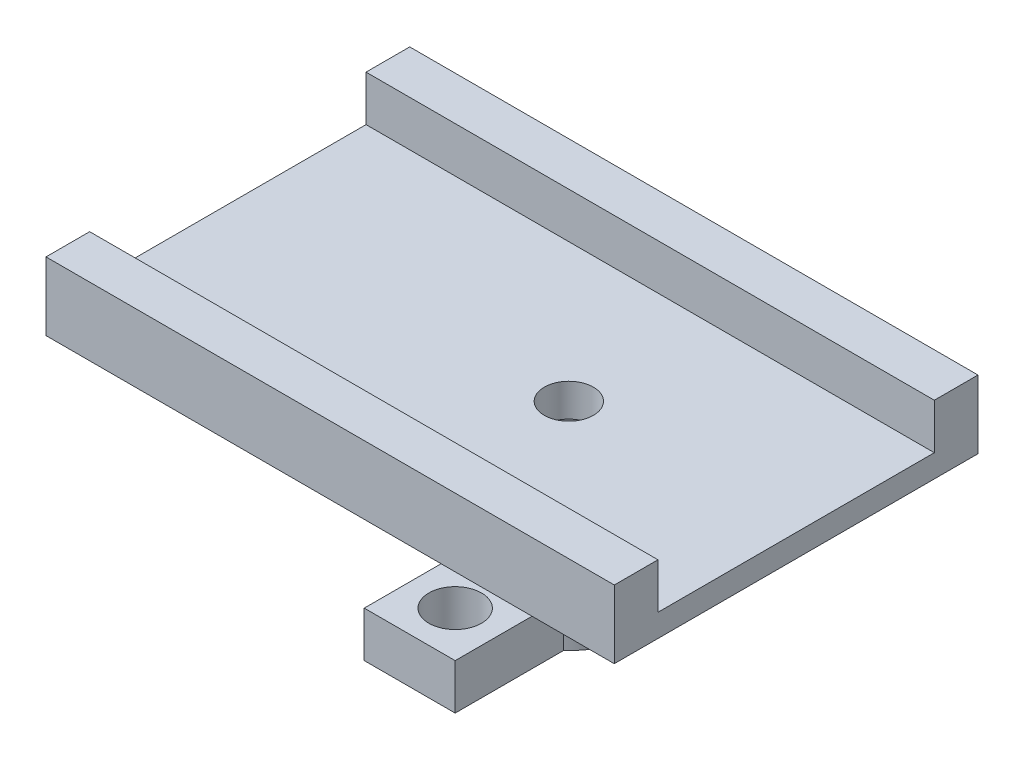
ISO-10303-21;
HEADER;
FILE_DESCRIPTION(('STEP AP214'),'2;1');
FILE_NAME('part.step','',(''),(''),'','','');
FILE_SCHEMA(('AUTOMOTIVE_DESIGN { 1 0 10303 214 1 1 1 1 }'));
ENDSEC;
DATA;
#1=APPLICATION_CONTEXT('core data for automotive mechanical design processes');
#2=APPLICATION_PROTOCOL_DEFINITION('international standard','automotive_design',2000,#1);
#3=PRODUCT_CONTEXT('',#1,'mechanical');
#4=PRODUCT('Part','Part','',(#3));
#5=PRODUCT_RELATED_PRODUCT_CATEGORY('part','',(#4));
#6=PRODUCT_DEFINITION_FORMATION('','',#4);
#7=PRODUCT_DEFINITION_CONTEXT('part definition',#1,'design');
#8=PRODUCT_DEFINITION('design','',#6,#7);
#9=PRODUCT_DEFINITION_SHAPE('','',#8);
#10=(LENGTH_UNIT() NAMED_UNIT(*) SI_UNIT(.MILLI.,.METRE.));
#11=(NAMED_UNIT(*) PLANE_ANGLE_UNIT() SI_UNIT($,.RADIAN.));
#12=(NAMED_UNIT(*) SI_UNIT($,.STERADIAN.) SOLID_ANGLE_UNIT());
#13=UNCERTAINTY_MEASURE_WITH_UNIT(LENGTH_MEASURE(1.E-05),#10,'distance_accuracy_value','');
#14=(GEOMETRIC_REPRESENTATION_CONTEXT(3) GLOBAL_UNCERTAINTY_ASSIGNED_CONTEXT((#13)) GLOBAL_UNIT_ASSIGNED_CONTEXT((#10,
#11,#12)) REPRESENTATION_CONTEXT('',''));
#15=CARTESIAN_POINT('',(0.,0.,0.));
#16=DIRECTION('',(0.,0.,1.));
#17=DIRECTION('',(1.,0.,0.));
#18=AXIS2_PLACEMENT_3D('',#15,#16,#17);
#19=CARTESIAN_POINT('',(47.625,-37.6757684192075,0.));
#20=DIRECTION('',(0.,1.,0.));
#21=DIRECTION('',(0.,0.,1.));
#22=AXIS2_PLACEMENT_3D('',#19,#20,#21);
#23=CYLINDRICAL_SURFACE('',#22,9.525);
#24=DIRECTION('',(0.,-1.,0.));
#25=VECTOR('',#24,1.);
#26=CARTESIAN_POINT('',(53.975,-4.38500005600004,-7.09951582856183));
#27=LINE('',#26,#25);
#28=CARTESIAN_POINT('',(53.975,-4.38500005600004,-7.09951582856183));
#29=VERTEX_POINT('',#28);
#30=CARTESIAN_POINT('',(53.975,-10.735000056,-7.09951582856183));
#31=VERTEX_POINT('',#30);
#32=EDGE_CURVE('E63',#29,#31,#27,.T.);
#33=ORIENTED_EDGE('',*,*,#32,.F.);
#34=CARTESIAN_POINT('',(47.625,-4.38500005600004,0.));
#35=DIRECTION('',(0.,1.,0.));
#36=DIRECTION('',(0.,0.,-1.));
#37=AXIS2_PLACEMENT_3D('',#34,#35,#36);
#38=CIRCLE('',#37,9.525);
#39=CARTESIAN_POINT('',(41.275,-4.38500005600004,-7.09951582856183));
#40=VERTEX_POINT('',#39);
#41=EDGE_CURVE('E58',#29,#40,#38,.T.);
#42=ORIENTED_EDGE('',*,*,#41,.T.);
#43=DIRECTION('',(0.,-1.,0.));
#44=VECTOR('',#43,1.);
#45=CARTESIAN_POINT('',(41.275,-4.38500005600004,-7.09951582856183));
#46=LINE('',#45,#44);
#47=CARTESIAN_POINT('',(41.275,-10.735000056,-7.09951582856183));
#48=VERTEX_POINT('',#47);
#49=EDGE_CURVE('E201',#40,#48,#46,.T.);
#50=ORIENTED_EDGE('',*,*,#49,.T.);
#51=CARTESIAN_POINT('',(47.625,-10.735000056,0.));
#52=DIRECTION('',(0.,-1.,0.));
#53=DIRECTION('',(0.,0.,-1.));
#54=AXIS2_PLACEMENT_3D('',#51,#52,#53);
#55=CIRCLE('',#54,9.525);
#56=CARTESIAN_POINT('',(41.275,-10.735000056,7.09951582856183));
#57=VERTEX_POINT('',#56);
#58=EDGE_CURVE('E283',#48,#57,#55,.F.);
#59=ORIENTED_EDGE('',*,*,#58,.T.);
#60=DIRECTION('',(0.,-1.,0.));
#61=VECTOR('',#60,1.);
#62=CARTESIAN_POINT('',(41.275,-4.38500005600004,7.09951582856183));
#63=LINE('',#62,#61);
#64=CARTESIAN_POINT('',(41.275,-4.38500005600004,7.09951582856183));
#65=VERTEX_POINT('',#64);
#66=EDGE_CURVE('E252',#65,#57,#63,.T.);
#67=ORIENTED_EDGE('',*,*,#66,.F.);
#68=CARTESIAN_POINT('',(47.625,-4.38500005600004,0.));
#69=DIRECTION('',(0.,1.,0.));
#70=DIRECTION('',(0.,0.,-1.));
#71=AXIS2_PLACEMENT_3D('',#68,#69,#70);
#72=CIRCLE('',#71,9.525);
#73=CARTESIAN_POINT('',(53.975,-4.38500005600004,7.09951582856183));
#74=VERTEX_POINT('',#73);
#75=EDGE_CURVE('E233',#65,#74,#72,.T.);
#76=ORIENTED_EDGE('',*,*,#75,.T.);
#77=DIRECTION('',(0.,-1.,0.));
#78=VECTOR('',#77,1.);
#79=CARTESIAN_POINT('',(53.975,-4.38500005600004,7.09951582856183));
#80=LINE('',#79,#78);
#81=CARTESIAN_POINT('',(53.975,-10.735000056,7.09951582856183));
#82=VERTEX_POINT('',#81);
#83=EDGE_CURVE('E249',#74,#82,#80,.T.);
#84=ORIENTED_EDGE('',*,*,#83,.T.);
#85=EDGE_CURVE('E281',#82,#31,#55,.F.);
#86=ORIENTED_EDGE('',*,*,#85,.T.);
#87=EDGE_LOOP('',(#33,#42,#50,#59,#67,#76,#84,#86));
#88=FACE_BOUND('',#87,.T.);
#89=DIRECTION('',(0.,-1.,0.));
#90=VECTOR('',#89,1.);
#91=CARTESIAN_POINT('',(53.43125,28.5761062672984,-7.55070102291833));
#92=LINE('',#91,#90);
#93=CARTESIAN_POINT('',(53.43125,3.175,-7.55070102291833));
#94=VERTEX_POINT('',#93);
#95=CARTESIAN_POINT('',(53.43125,0.785874999999992,-7.55070102291833));
#96=VERTEX_POINT('',#95);
#97=EDGE_CURVE('E248',#94,#96,#92,.T.);
#98=ORIENTED_EDGE('',*,*,#97,.F.);
#99=CARTESIAN_POINT('',(47.625,3.175,0.));
#100=DIRECTION('',(0.,1.,0.));
#101=DIRECTION('',(0.,0.,1.));
#102=AXIS2_PLACEMENT_3D('',#99,#100,#101);
#103=CIRCLE('',#102,9.525);
#104=CARTESIAN_POINT('',(41.81875,3.175,-7.55070102291833));
#105=VERTEX_POINT('',#104);
#106=EDGE_CURVE('E374',#94,#105,#103,.F.);
#107=ORIENTED_EDGE('',*,*,#106,.T.);
#108=DIRECTION('',(0.,-1.,0.));
#109=VECTOR('',#108,1.);
#110=CARTESIAN_POINT('',(41.81875,28.5761062672984,-7.55070102291833));
#111=LINE('',#110,#109);
#112=CARTESIAN_POINT('',(41.81875,0.785874999999992,-7.55070102291833));
#113=VERTEX_POINT('',#112);
#114=EDGE_CURVE('E259',#105,#113,#111,.T.);
#115=ORIENTED_EDGE('',*,*,#114,.T.);
#116=CARTESIAN_POINT('',(47.625,0.785874999999992,0.));
#117=DIRECTION('',(0.,1.,0.));
#118=DIRECTION('',(0.,0.,1.));
#119=AXIS2_PLACEMENT_3D('',#116,#117,#118);
#120=CIRCLE('',#119,9.525);
#121=EDGE_CURVE('E256',#96,#113,#120,.T.);
#122=ORIENTED_EDGE('',*,*,#121,.F.);
#123=EDGE_LOOP('',(#98,#107,#115,#122));
#124=FACE_BOUND('',#123,.T.);
#125=ADVANCED_FACE('F37',(#88,#124),#23,.T.);
#126=CARTESIAN_POINT('',(-54.6910193932159,9.525,25.4));
#127=DIRECTION('',(0.,1.,0.));
#128=DIRECTION('',(0.,0.,1.));
#129=AXIS2_PLACEMENT_3D('',#126,#127,#128);
#130=PLANE('',#129);
#131=CARTESIAN_POINT('',(47.625,9.525,0.));
#132=DIRECTION('',(0.,1.,0.));
#133=DIRECTION('',(0.,0.,1.));
#134=AXIS2_PLACEMENT_3D('',#131,#132,#133);
#135=CIRCLE('',#134,15.875);
#136=CARTESIAN_POINT('',(47.625,9.525,15.875));
#137=VERTEX_POINT('',#136);
#138=EDGE_CURVE('E336',#137,#137,#135,.T.);
#139=ORIENTED_EDGE('',*,*,#138,.T.);
#140=EDGE_LOOP('',(#139));
#141=FACE_BOUND('',#140,.T.);
#142=DIRECTION('',(0.,0.,-1.));
#143=VECTOR('',#142,1.);
#144=CARTESIAN_POINT('',(0.,9.525,25.4));
#145=LINE('',#144,#143);
#146=CARTESIAN_POINT('',(0.,9.52500000000003,25.4));
#147=VERTEX_POINT('',#146);
#148=CARTESIAN_POINT('',(0.,9.52500000000003,-25.4));
#149=VERTEX_POINT('',#148);
#150=EDGE_CURVE('E354',#147,#149,#145,.T.);
#151=ORIENTED_EDGE('',*,*,#150,.T.);
#152=DIRECTION('',(1.,0.,0.));
#153=VECTOR('',#152,1.);
#154=CARTESIAN_POINT('',(-54.6910193932159,9.525,-25.4));
#155=LINE('',#154,#153);
#156=CARTESIAN_POINT('',(79.375,9.52500000000003,-25.4));
#157=VERTEX_POINT('',#156);
#158=EDGE_CURVE('E357',#149,#157,#155,.T.);
#159=ORIENTED_EDGE('',*,*,#158,.T.);
#160=DIRECTION('',(0.,0.,1.));
#161=VECTOR('',#160,1.);
#162=CARTESIAN_POINT('',(79.375,9.525,25.4));
#163=LINE('',#162,#161);
#164=CARTESIAN_POINT('',(79.375,9.52500000000003,25.4));
#165=VERTEX_POINT('',#164);
#166=EDGE_CURVE('E303',#157,#165,#163,.T.);
#167=ORIENTED_EDGE('',*,*,#166,.T.);
#168=DIRECTION('',(1.,0.,0.));
#169=VECTOR('',#168,1.);
#170=CARTESIAN_POINT('',(-54.6910193932159,9.525,25.4));
#171=LINE('',#170,#169);
#172=EDGE_CURVE('E308',#147,#165,#171,.T.);
#173=ORIENTED_EDGE('',*,*,#172,.F.);
#174=EDGE_LOOP('',(#151,#159,#167,#173));
#175=FACE_BOUND('',#174,.T.);
#176=ADVANCED_FACE('F412',(#141,#175),#130,.F.);
#177=CARTESIAN_POINT('',(0.,106.939220205815,25.4));
#178=DIRECTION('',(1.,0.,0.));
#179=DIRECTION('',(0.,0.,-1.));
#180=AXIS2_PLACEMENT_3D('',#177,#178,#179);
#181=PLANE('',#180);
#182=ORIENTED_EDGE('',*,*,#150,.F.);
#183=DIRECTION('',(0.,-1.,0.));
#184=VECTOR('',#183,1.);
#185=CARTESIAN_POINT('',(0.,106.939220205815,25.4));
#186=LINE('',#185,#184);
#187=CARTESIAN_POINT('',(0.,19.05,25.4));
#188=VERTEX_POINT('',#187);
#189=EDGE_CURVE('E367',#188,#147,#186,.T.);
#190=ORIENTED_EDGE('',*,*,#189,.F.);
#191=DIRECTION('',(0.,0.,1.));
#192=VECTOR('',#191,1.);
#193=CARTESIAN_POINT('',(0.,19.05,19.3));
#194=LINE('',#193,#192);
#195=CARTESIAN_POINT('',(0.,19.05,19.3));
#196=VERTEX_POINT('',#195);
#197=EDGE_CURVE('E343',#196,#188,#194,.T.);
#198=ORIENTED_EDGE('',*,*,#197,.F.);
#199=DIRECTION('',(0.,-1.,0.));
#200=VECTOR('',#199,1.);
#201=CARTESIAN_POINT('',(0.,98.659048637702,19.3));
#202=LINE('',#201,#200);
#203=CARTESIAN_POINT('',(0.,12.7,19.3));
#204=VERTEX_POINT('',#203);
#205=EDGE_CURVE('E334',#196,#204,#202,.T.);
#206=ORIENTED_EDGE('',*,*,#205,.T.);
#207=DIRECTION('',(0.,0.,-1.));
#208=VECTOR('',#207,1.);
#209=CARTESIAN_POINT('',(0.,12.7,25.4));
#210=LINE('',#209,#208);
#211=CARTESIAN_POINT('',(0.,12.7,-19.3));
#212=VERTEX_POINT('',#211);
#213=EDGE_CURVE('E307',#204,#212,#210,.T.);
#214=ORIENTED_EDGE('',*,*,#213,.T.);
#215=DIRECTION('',(0.,-1.,0.));
#216=VECTOR('',#215,1.);
#217=CARTESIAN_POINT('',(0.,98.659048637702,-19.3));
#218=LINE('',#217,#216);
#219=CARTESIAN_POINT('',(0.,19.05,-19.3));
#220=VERTEX_POINT('',#219);
#221=EDGE_CURVE('E315',#220,#212,#218,.T.);
#222=ORIENTED_EDGE('',*,*,#221,.F.);
#223=DIRECTION('',(0.,0.,1.));
#224=VECTOR('',#223,1.);
#225=CARTESIAN_POINT('',(0.,19.05,-19.3));
#226=LINE('',#225,#224);
#227=CARTESIAN_POINT('',(0.,19.05,-25.4));
#228=VERTEX_POINT('',#227);
#229=EDGE_CURVE('E328',#228,#220,#226,.T.);
#230=ORIENTED_EDGE('',*,*,#229,.F.);
#231=DIRECTION('',(0.,-1.,0.));
#232=VECTOR('',#231,1.);
#233=CARTESIAN_POINT('',(0.,106.939220205815,-25.4));
#234=LINE('',#233,#232);
#235=EDGE_CURVE('E364',#228,#149,#234,.T.);
#236=ORIENTED_EDGE('',*,*,#235,.T.);
#237=EDGE_LOOP('',(#182,#190,#198,#206,#214,#222,#230,#236));
#238=FACE_BOUND('',#237,.T.);
#239=ADVANCED_FACE('F421',(#238),#181,.F.);
#240=CARTESIAN_POINT('',(0.,106.939220205815,-25.4));
#241=DIRECTION('',(0.,0.,1.));
#242=DIRECTION('',(1.,0.,0.));
#243=AXIS2_PLACEMENT_3D('',#240,#241,#242);
#244=PLANE('',#243);
#245=ORIENTED_EDGE('',*,*,#158,.F.);
#246=ORIENTED_EDGE('',*,*,#235,.F.);
#247=DIRECTION('',(-1.,0.,0.));
#248=VECTOR('',#247,1.);
#249=CARTESIAN_POINT('',(0.,19.05,-25.4));
#250=LINE('',#249,#248);
#251=CARTESIAN_POINT('',(79.375,19.05,-25.4));
#252=VERTEX_POINT('',#251);
#253=EDGE_CURVE('E325',#252,#228,#250,.T.);
#254=ORIENTED_EDGE('',*,*,#253,.F.);
#255=DIRECTION('',(0.,-1.,0.));
#256=VECTOR('',#255,1.);
#257=CARTESIAN_POINT('',(79.375,106.939220205815,-25.4));
#258=LINE('',#257,#256);
#259=EDGE_CURVE('E310',#252,#157,#258,.T.);
#260=ORIENTED_EDGE('',*,*,#259,.T.);
#261=EDGE_LOOP('',(#245,#246,#254,#260));
#262=FACE_BOUND('',#261,.T.);
#263=ADVANCED_FACE('F445',(#262),#244,.F.);
#264=CARTESIAN_POINT('',(79.375,106.939220205815,25.4));
#265=DIRECTION('',(-1.,0.,0.));
#266=DIRECTION('',(0.,0.,1.));
#267=AXIS2_PLACEMENT_3D('',#264,#265,#266);
#268=PLANE('',#267);
#269=ORIENTED_EDGE('',*,*,#166,.F.);
#270=ORIENTED_EDGE('',*,*,#259,.F.);
#271=DIRECTION('',(0.,0.,-1.));
#272=VECTOR('',#271,1.);
#273=CARTESIAN_POINT('',(79.375,19.05,-19.3));
#274=LINE('',#273,#272);
#275=CARTESIAN_POINT('',(79.375,19.05,-19.3));
#276=VERTEX_POINT('',#275);
#277=EDGE_CURVE('E322',#276,#252,#274,.T.);
#278=ORIENTED_EDGE('',*,*,#277,.F.);
#279=DIRECTION('',(0.,-1.,0.));
#280=VECTOR('',#279,1.);
#281=CARTESIAN_POINT('',(79.375,98.659048637702,-19.3));
#282=LINE('',#281,#280);
#283=CARTESIAN_POINT('',(79.375,12.7,-19.3));
#284=VERTEX_POINT('',#283);
#285=EDGE_CURVE('E311',#276,#284,#282,.T.);
#286=ORIENTED_EDGE('',*,*,#285,.T.);
#287=DIRECTION('',(0.,0.,1.));
#288=VECTOR('',#287,1.);
#289=CARTESIAN_POINT('',(79.375,12.7,25.4));
#290=LINE('',#289,#288);
#291=CARTESIAN_POINT('',(79.375,12.7,19.3));
#292=VERTEX_POINT('',#291);
#293=EDGE_CURVE('E304',#284,#292,#290,.T.);
#294=ORIENTED_EDGE('',*,*,#293,.T.);
#295=DIRECTION('',(0.,-1.,0.));
#296=VECTOR('',#295,1.);
#297=CARTESIAN_POINT('',(79.375,98.659048637702,19.3));
#298=LINE('',#297,#296);
#299=CARTESIAN_POINT('',(79.375,19.05,19.3));
#300=VERTEX_POINT('',#299);
#301=EDGE_CURVE('E337',#300,#292,#298,.T.);
#302=ORIENTED_EDGE('',*,*,#301,.F.);
#303=DIRECTION('',(0.,0.,-1.));
#304=VECTOR('',#303,1.);
#305=CARTESIAN_POINT('',(79.375,19.05,19.3));
#306=LINE('',#305,#304);
#307=CARTESIAN_POINT('',(79.375,19.05,25.4));
#308=VERTEX_POINT('',#307);
#309=EDGE_CURVE('E314',#308,#300,#306,.T.);
#310=ORIENTED_EDGE('',*,*,#309,.F.);
#311=DIRECTION('',(0.,-1.,0.));
#312=VECTOR('',#311,1.);
#313=CARTESIAN_POINT('',(79.375,106.939220205815,25.4));
#314=LINE('',#313,#312);
#315=EDGE_CURVE('E331',#308,#165,#314,.T.);
#316=ORIENTED_EDGE('',*,*,#315,.T.);
#317=EDGE_LOOP('',(#269,#270,#278,#286,#294,#302,#310,#316));
#318=FACE_BOUND('',#317,.T.);
#319=ADVANCED_FACE('F442',(#318),#268,.F.);
#320=CARTESIAN_POINT('',(0.,12.7,0.));
#321=DIRECTION('',(0.,-1.,0.));
#322=DIRECTION('',(0.,0.,-1.));
#323=AXIS2_PLACEMENT_3D('',#320,#321,#322);
#324=PLANE('',#323);
#325=DIRECTION('',(-1.,0.,0.));
#326=VECTOR('',#325,1.);
#327=CARTESIAN_POINT('',(0.,12.7,19.3));
#328=LINE('',#327,#326);
#329=EDGE_CURVE('E339',#292,#204,#328,.T.);
#330=ORIENTED_EDGE('',*,*,#329,.F.);
#331=ORIENTED_EDGE('',*,*,#293,.F.);
#332=DIRECTION('',(1.,0.,0.));
#333=VECTOR('',#332,1.);
#334=CARTESIAN_POINT('',(0.,12.7,-19.3));
#335=LINE('',#334,#333);
#336=EDGE_CURVE('E318',#212,#284,#335,.T.);
#337=ORIENTED_EDGE('',*,*,#336,.F.);
#338=ORIENTED_EDGE('',*,*,#213,.F.);
#339=EDGE_LOOP('',(#330,#331,#337,#338));
#340=FACE_BOUND('',#339,.T.);
#341=CARTESIAN_POINT('',(47.625,12.7,0.));
#342=DIRECTION('',(0.,1.,0.));
#343=DIRECTION('',(0.,0.,1.));
#344=AXIS2_PLACEMENT_3D('',#341,#342,#343);
#345=CIRCLE('',#344,3.425);
#346=CARTESIAN_POINT('',(47.625,12.7,3.425));
#347=VERTEX_POINT('',#346);
#348=EDGE_CURVE('E280',#347,#347,#345,.T.);
#349=ORIENTED_EDGE('',*,*,#348,.F.);
#350=EDGE_LOOP('',(#349));
#351=FACE_BOUND('',#350,.T.);
#352=ADVANCED_FACE('F440',(#340,#351),#324,.F.);
#353=CARTESIAN_POINT('',(0.,106.939220205815,25.4));
#354=DIRECTION('',(0.,0.,-1.));
#355=DIRECTION('',(-1.,0.,0.));
#356=AXIS2_PLACEMENT_3D('',#353,#354,#355);
#357=PLANE('',#356);
#358=ORIENTED_EDGE('',*,*,#189,.T.);
#359=ORIENTED_EDGE('',*,*,#172,.T.);
#360=ORIENTED_EDGE('',*,*,#315,.F.);
#361=DIRECTION('',(1.,0.,0.));
#362=VECTOR('',#361,1.);
#363=CARTESIAN_POINT('',(0.,19.05,25.4));
#364=LINE('',#363,#362);
#365=EDGE_CURVE('E346',#188,#308,#364,.T.);
#366=ORIENTED_EDGE('',*,*,#365,.F.);
#367=EDGE_LOOP('',(#358,#359,#360,#366));
#368=FACE_BOUND('',#367,.T.);
#369=ADVANCED_FACE('F430',(#368),#357,.F.);
#370=CARTESIAN_POINT('',(0.,98.659048637702,-19.3));
#371=DIRECTION('',(0.,0.,-1.));
#372=DIRECTION('',(-1.,0.,0.));
#373=AXIS2_PLACEMENT_3D('',#370,#371,#372);
#374=PLANE('',#373);
#375=DIRECTION('',(1.,0.,0.));
#376=VECTOR('',#375,1.);
#377=CARTESIAN_POINT('',(0.,19.05,-19.3));
#378=LINE('',#377,#376);
#379=EDGE_CURVE('E319',#220,#276,#378,.T.);
#380=ORIENTED_EDGE('',*,*,#379,.F.);
#381=ORIENTED_EDGE('',*,*,#221,.T.);
#382=ORIENTED_EDGE('',*,*,#336,.T.);
#383=ORIENTED_EDGE('',*,*,#285,.F.);
#384=EDGE_LOOP('',(#380,#381,#382,#383));
#385=FACE_BOUND('',#384,.T.);
#386=ADVANCED_FACE('F426',(#385),#374,.F.);
#387=CARTESIAN_POINT('',(0.,19.05,0.));
#388=DIRECTION('',(0.,1.,0.));
#389=DIRECTION('',(0.,0.,1.));
#390=AXIS2_PLACEMENT_3D('',#387,#388,#389);
#391=PLANE('',#390);
#392=ORIENTED_EDGE('',*,*,#379,.T.);
#393=ORIENTED_EDGE('',*,*,#277,.T.);
#394=ORIENTED_EDGE('',*,*,#253,.T.);
#395=ORIENTED_EDGE('',*,*,#229,.T.);
#396=EDGE_LOOP('',(#392,#393,#394,#395));
#397=FACE_BOUND('',#396,.T.);
#398=ADVANCED_FACE('F422',(#397),#391,.T.);
#399=CARTESIAN_POINT('',(0.,98.659048637702,19.3));
#400=DIRECTION('',(0.,0.,1.));
#401=DIRECTION('',(1.,0.,0.));
#402=AXIS2_PLACEMENT_3D('',#399,#400,#401);
#403=PLANE('',#402);
#404=DIRECTION('',(-1.,0.,0.));
#405=VECTOR('',#404,1.);
#406=CARTESIAN_POINT('',(0.,19.05,19.3));
#407=LINE('',#406,#405);
#408=EDGE_CURVE('E340',#300,#196,#407,.T.);
#409=ORIENTED_EDGE('',*,*,#408,.F.);
#410=ORIENTED_EDGE('',*,*,#301,.T.);
#411=ORIENTED_EDGE('',*,*,#329,.T.);
#412=ORIENTED_EDGE('',*,*,#205,.F.);
#413=EDGE_LOOP('',(#409,#410,#411,#412));
#414=FACE_BOUND('',#413,.T.);
#415=ADVANCED_FACE('F425',(#414),#403,.F.);
#416=CARTESIAN_POINT('',(0.,19.05,0.));
#417=DIRECTION('',(0.,1.,0.));
#418=DIRECTION('',(0.,0.,1.));
#419=AXIS2_PLACEMENT_3D('',#416,#417,#418);
#420=PLANE('',#419);
#421=ORIENTED_EDGE('',*,*,#408,.T.);
#422=ORIENTED_EDGE('',*,*,#197,.T.);
#423=ORIENTED_EDGE('',*,*,#365,.T.);
#424=ORIENTED_EDGE('',*,*,#309,.T.);
#425=EDGE_LOOP('',(#421,#422,#423,#424));
#426=FACE_BOUND('',#425,.T.);
#427=ADVANCED_FACE('F419',(#426),#420,.T.);
#428=CARTESIAN_POINT('',(47.625,-20.4223629582557,0.));
#429=DIRECTION('',(0.,1.,0.));
#430=DIRECTION('',(0.,0.,1.));
#431=AXIS2_PLACEMENT_3D('',#428,#429,#430);
#432=CYLINDRICAL_SURFACE('',#431,3.425);
#433=CARTESIAN_POINT('',(47.625,8.11999999999999,0.));
#434=DIRECTION('',(0.,1.,0.));
#435=DIRECTION('',(0.,0.,1.));
#436=AXIS2_PLACEMENT_3D('',#433,#434,#435);
#437=CIRCLE('',#436,3.425);
#438=CARTESIAN_POINT('',(47.625,8.11999999999999,3.425));
#439=VERTEX_POINT('',#438);
#440=EDGE_CURVE('E263',#439,#439,#437,.F.);
#441=ORIENTED_EDGE('',*,*,#440,.T.);
#442=EDGE_LOOP('',(#441));
#443=FACE_BOUND('',#442,.T.);
#444=ORIENTED_EDGE('',*,*,#348,.T.);
#445=EDGE_LOOP('',(#444));
#446=FACE_BOUND('',#445,.T.);
#447=ADVANCED_FACE('F416',(#443,#446),#432,.F.);
#448=CARTESIAN_POINT('',(47.625,-10.735000056,0.));
#449=DIRECTION('',(0.,-1.,0.));
#450=DIRECTION('',(0.,0.,-1.));
#451=AXIS2_PLACEMENT_3D('',#448,#449,#450);
#452=CIRCLE('',#451,3.425);
#453=CARTESIAN_POINT('',(47.625,-10.735000056,-3.425));
#454=VERTEX_POINT('',#453);
#455=EDGE_CURVE('E277',#454,#454,#452,.F.);
#456=ORIENTED_EDGE('',*,*,#455,.F.);
#457=EDGE_LOOP('',(#456));
#458=FACE_BOUND('',#457,.T.);
#459=CARTESIAN_POINT('',(47.625,0.785874999999991,0.));
#460=DIRECTION('',(0.,1.,0.));
#461=DIRECTION('',(0.,0.,1.));
#462=AXIS2_PLACEMENT_3D('',#459,#460,#461);
#463=CIRCLE('',#462,3.425);
#464=CARTESIAN_POINT('',(47.625,0.785874999999991,3.425));
#465=VERTEX_POINT('',#464);
#466=EDGE_CURVE('E284',#465,#465,#463,.T.);
#467=ORIENTED_EDGE('',*,*,#466,.T.);
#468=EDGE_LOOP('',(#467));
#469=FACE_BOUND('',#468,.T.);
#470=ADVANCED_FACE('F408',(#458,#469),#432,.F.);
#471=CARTESIAN_POINT('',(42.06875,0.785874999999992,-3.20790243318486));
#472=DIRECTION('',(0.,1.,0.));
#473=DIRECTION('',(0.,0.,1.));
#474=AXIS2_PLACEMENT_3D('',#471,#472,#473);
#475=PLANE('',#474);
#476=DIRECTION('',(0.,0.,1.));
#477=VECTOR('',#476,1.);
#478=CARTESIAN_POINT('',(53.43125,0.785874999999991,3.35224000048226));
#479=LINE('',#478,#477);
#480=CARTESIAN_POINT('',(53.43125,0.785874999999991,3.35224000048226));
#481=VERTEX_POINT('',#480);
#482=EDGE_CURVE('E287',#96,#481,#479,.T.);
#483=ORIENTED_EDGE('',*,*,#482,.F.);
#484=ORIENTED_EDGE('',*,*,#121,.T.);
#485=DIRECTION('',(0.,0.,-1.));
#486=VECTOR('',#485,1.);
#487=CARTESIAN_POINT('',(41.81875,0.785874999999991,-3.35224000048226));
#488=LINE('',#487,#486);
#489=CARTESIAN_POINT('',(41.81875,0.785874999999991,3.35224000048227));
#490=VERTEX_POINT('',#489);
#491=EDGE_CURVE('E293',#490,#113,#488,.T.);
#492=ORIENTED_EDGE('',*,*,#491,.F.);
#493=DIRECTION('',(-0.866025403784439,0.,-0.5));
#494=VECTOR('',#493,1.);
#495=CARTESIAN_POINT('',(41.81875,0.785874999999991,3.35224000048227));
#496=LINE('',#495,#494);
#497=CARTESIAN_POINT('',(47.625,0.785874999999991,6.70448000096453));
#498=VERTEX_POINT('',#497);
#499=EDGE_CURVE('E291',#498,#490,#496,.T.);
#500=ORIENTED_EDGE('',*,*,#499,.F.);
#501=DIRECTION('',(-0.866025403784439,0.,0.5));
#502=VECTOR('',#501,1.);
#503=CARTESIAN_POINT('',(47.625,0.785874999999991,6.70448000096453));
#504=LINE('',#503,#502);
#505=EDGE_CURVE('E289',#481,#498,#504,.T.);
#506=ORIENTED_EDGE('',*,*,#505,.F.);
#507=EDGE_LOOP('',(#483,#484,#492,#500,#506));
#508=FACE_BOUND('',#507,.T.);
#509=ORIENTED_EDGE('',*,*,#466,.F.);
#510=EDGE_LOOP('',(#509));
#511=FACE_BOUND('',#510,.T.);
#512=ADVANCED_FACE('F404',(#508,#511),#475,.T.);
#513=CARTESIAN_POINT('',(53.43125,-17.4525117525582,3.35224000048226));
#514=DIRECTION('',(1.,0.,0.));
#515=DIRECTION('',(0.,0.,-1.));
#516=AXIS2_PLACEMENT_3D('',#513,#514,#515);
#517=PLANE('',#516);
#518=ORIENTED_EDGE('',*,*,#482,.T.);
#519=DIRECTION('',(0.,1.,0.));
#520=VECTOR('',#519,1.);
#521=CARTESIAN_POINT('',(53.43125,-17.4525117525582,3.35224000048226));
#522=LINE('',#521,#520);
#523=CARTESIAN_POINT('',(53.43125,8.11999999999999,3.35224000048226));
#524=VERTEX_POINT('',#523);
#525=EDGE_CURVE('E296',#481,#524,#522,.T.);
#526=ORIENTED_EDGE('',*,*,#525,.T.);
#527=DIRECTION('',(0.,0.,-1.));
#528=VECTOR('',#527,1.);
#529=CARTESIAN_POINT('',(53.43125,8.11999999999999,-3.35224000048227));
#530=LINE('',#529,#528);
#531=CARTESIAN_POINT('',(53.43125,8.11999999999999,-10.3774583999343));
#532=VERTEX_POINT('',#531);
#533=EDGE_CURVE('E267',#524,#532,#530,.T.);
#534=ORIENTED_EDGE('',*,*,#533,.T.);
#535=CARTESIAN_POINT('',(53.43125,8.11999999999999,-10.3774583999343));
#536=CARTESIAN_POINT('',(53.43125,8.00754081064446,-10.2175178402122));
#537=CARTESIAN_POINT('',(53.43125,7.88898066526426,-10.0618398130804));
#538=CARTESIAN_POINT('',(53.43125,7.64000627854227,-9.76005068967487));
#539=CARTESIAN_POINT('',(53.43125,7.50958187618686,-9.61394798184213));
#540=CARTESIAN_POINT('',(53.43125,7.23620625484164,-9.33137450012157));
#541=CARTESIAN_POINT('',(53.43125,7.09315346792789,-9.19500151538504));
#542=CARTESIAN_POINT('',(53.43125,6.79619347632435,-8.93483755620271));
#543=CARTESIAN_POINT('',(53.43125,6.64229022056811,-8.81104204392833));
#544=CARTESIAN_POINT('',(53.43125,6.2143843552523,-8.49703159988468));
#545=CARTESIAN_POINT('',(53.43125,5.93057705499142,-8.31968903814091));
#546=CARTESIAN_POINT('',(53.43125,5.4869459803191,-8.09100543793005));
#547=CARTESIAN_POINT('',(53.43125,5.33643445849281,-8.02111282947439));
#548=CARTESIAN_POINT('',(53.43125,5.02994442667739,-7.89464847590192));
#549=CARTESIAN_POINT('',(53.43125,4.87396943736436,-7.83806832723514));
#550=CARTESIAN_POINT('',(53.43125,4.5917034914164,-7.7500086304763));
#551=CARTESIAN_POINT('',(53.43125,4.46627278354757,-7.71574724741861));
#552=CARTESIAN_POINT('',(53.43125,4.21323884474721,-7.65657702714001));
#553=CARTESIAN_POINT('',(53.43125,4.08563610740999,-7.63166609392163));
#554=CARTESIAN_POINT('',(53.43125,3.82796999488782,-7.59144063595022));
#555=CARTESIAN_POINT('',(53.43125,3.69789546754102,-7.57619731741361));
#556=CARTESIAN_POINT('',(53.43125,3.43688525222224,-7.55580973547665));
#557=CARTESIAN_POINT('',(53.43125,3.30594911814176,-7.55067119815092));
#558=CARTESIAN_POINT('',(53.43125,3.175,-7.55070102291834));
#559=B_SPLINE_CURVE_WITH_KNOTS('',3,(#535,#536,#537,#538,#539,#540,#541,#542,#543,#544,#545,
#546,#547,#548,#549,#550,#551,#552,#553,#554,#555,#556,#557,#558),.UNSPECIFIED.,.F.,.F.,(4,2,2,
2,2,2,2,2,2,2,2,4),(0.,0.586447207188784,1.17340148632939,1.76560326171781,2.35759061206748,
3.35670039489551,3.85406217911823,4.35110915405405,4.74086217938904,5.13052778540989,
5.52303110089393,5.915756772143),.UNSPECIFIED.);
#560=EDGE_CURVE('E11',#532,#94,#559,.T.);
#561=ORIENTED_EDGE('',*,*,#560,.T.);
#562=ORIENTED_EDGE('',*,*,#97,.T.);
#563=EDGE_LOOP('',(#518,#526,#534,#561,#562));
#564=FACE_BOUND('',#563,.T.);
#565=ADVANCED_FACE('F399',(#564),#517,.F.);
#566=CARTESIAN_POINT('',(47.625,-17.4525117525582,6.70448000096453));
#567=DIRECTION('',(0.5,0.,0.866025403784439));
#568=DIRECTION('',(0.866025403784439,0.,-0.5));
#569=AXIS2_PLACEMENT_3D('',#566,#567,#568);
#570=PLANE('',#569);
#571=ORIENTED_EDGE('',*,*,#505,.T.);
#572=DIRECTION('',(0.,1.,0.));
#573=VECTOR('',#572,1.);
#574=CARTESIAN_POINT('',(47.625,-17.4525117525582,6.70448000096453));
#575=LINE('',#574,#573);
#576=CARTESIAN_POINT('',(47.625,8.12,6.70448000096453));
#577=VERTEX_POINT('',#576);
#578=EDGE_CURVE('E298',#498,#577,#575,.T.);
#579=ORIENTED_EDGE('',*,*,#578,.T.);
#580=DIRECTION('',(0.866025403784439,0.,-0.5));
#581=VECTOR('',#580,1.);
#582=CARTESIAN_POINT('',(47.625,8.11999999999999,6.70448000096453));
#583=LINE('',#582,#581);
#584=EDGE_CURVE('E269',#577,#524,#583,.T.);
#585=ORIENTED_EDGE('',*,*,#584,.T.);
#586=ORIENTED_EDGE('',*,*,#525,.F.);
#587=EDGE_LOOP('',(#571,#579,#585,#586));
#588=FACE_BOUND('',#587,.T.);
#589=ADVANCED_FACE('F396',(#588),#570,.F.);
#590=CARTESIAN_POINT('',(41.81875,-17.4525117525582,3.35224000048227));
#591=DIRECTION('',(-0.5,0.,0.866025403784439));
#592=DIRECTION('',(0.866025403784439,0.,0.5));
#593=AXIS2_PLACEMENT_3D('',#590,#591,#592);
#594=PLANE('',#593);
#595=ORIENTED_EDGE('',*,*,#499,.T.);
#596=DIRECTION('',(0.,1.,0.));
#597=VECTOR('',#596,1.);
#598=CARTESIAN_POINT('',(41.81875,-17.4525117525582,3.35224000048227));
#599=LINE('',#598,#597);
#600=CARTESIAN_POINT('',(41.81875,8.12,3.35224000048227));
#601=VERTEX_POINT('',#600);
#602=EDGE_CURVE('E276',#490,#601,#599,.T.);
#603=ORIENTED_EDGE('',*,*,#602,.T.);
#604=DIRECTION('',(0.866025403784439,0.,0.5));
#605=VECTOR('',#604,1.);
#606=CARTESIAN_POINT('',(41.81875,8.11999999999999,3.35224000048227));
#607=LINE('',#606,#605);
#608=EDGE_CURVE('E260',#601,#577,#607,.T.);
#609=ORIENTED_EDGE('',*,*,#608,.T.);
#610=ORIENTED_EDGE('',*,*,#578,.F.);
#611=EDGE_LOOP('',(#595,#603,#609,#610));
#612=FACE_BOUND('',#611,.T.);
#613=ADVANCED_FACE('F390',(#612),#594,.F.);
#614=CARTESIAN_POINT('',(41.81875,-17.4525117525582,-3.35224000048226));
#615=DIRECTION('',(-1.,0.,0.));
#616=DIRECTION('',(0.,0.,1.));
#617=AXIS2_PLACEMENT_3D('',#614,#615,#616);
#618=PLANE('',#617);
#619=ORIENTED_EDGE('',*,*,#491,.T.);
#620=ORIENTED_EDGE('',*,*,#114,.F.);
#621=CARTESIAN_POINT('',(41.81875,3.175,-7.55070102291833));
#622=CARTESIAN_POINT('',(41.81875,3.25377504624211,-7.55069904342923));
#623=CARTESIAN_POINT('',(41.81875,3.33253815732853,-7.55255073860587));
#624=CARTESIAN_POINT('',(41.81875,3.48988696992544,-7.55993797624769));
#625=CARTESIAN_POINT('',(41.81875,3.56847268148891,-7.56547330442652));
#626=CARTESIAN_POINT('',(41.81875,3.8035771719872,-7.58755384675489));
#627=CARTESIAN_POINT('',(41.81875,3.95961472038874,-7.6095737244266));
#628=CARTESIAN_POINT('',(41.81875,4.26749168100099,-7.66741143011034));
#629=CARTESIAN_POINT('',(41.81875,4.41935722242224,-7.70309225540201));
#630=CARTESIAN_POINT('',(41.81875,4.71943169837953,-7.78750406746283));
#631=CARTESIAN_POINT('',(41.81875,4.86764003569725,-7.83623717045617));
#632=CARTESIAN_POINT('',(41.81875,5.15898988116384,-7.94565564652727));
#633=CARTESIAN_POINT('',(41.81875,5.30214693221718,-8.00629973082468));
#634=CARTESIAN_POINT('',(41.81875,5.58319133136553,-8.13865246278416));
#635=CARTESIAN_POINT('',(41.81875,5.72107876803142,-8.21036092437572));
#636=CARTESIAN_POINT('',(41.81875,6.12727471470832,-8.44138637738165));
#637=CARTESIAN_POINT('',(41.81875,6.38699220494419,-8.61617051940233));
#638=CARTESIAN_POINT('',(41.81875,6.77656600660295,-8.91914371996026));
#639=CARTESIAN_POINT('',(41.81875,6.91532019958053,-9.03626459454085));
#640=CARTESIAN_POINT('',(41.81875,7.18353291197138,-9.28083404002442));
#641=CARTESIAN_POINT('',(41.81875,7.3129890772992,-9.4082852091));
#642=CARTESIAN_POINT('',(41.81875,7.56121386769153,-9.67143960252013));
#643=CARTESIAN_POINT('',(41.81875,7.6800525359509,-9.80707702903986));
#644=CARTESIAN_POINT('',(41.81875,7.90764895429948,-10.0864252115386));
#645=CARTESIAN_POINT('',(41.81875,8.01641292577018,-10.2301308958974));
#646=CARTESIAN_POINT('',(41.81875,8.11999999999999,-10.3774583999343));
#647=B_SPLINE_CURVE_WITH_KNOTS('',3,(#621,#622,#623,#624,#625,#626,#627,#628,#629,#630,#631,
#632,#633,#634,#635,#636,#637,#638,#639,#640,#641,#642,#643,#644,#645,#646),.UNSPECIFIED.,.F.,
.F.,(4,2,2,2,2,2,2,2,2,2,2,2,4),(0.,0.236279889068033,0.472546034331071,0.944566117001281,
1.41197141571471,1.87945254286438,2.345340896381,2.81122141587021,3.74656106908502,
4.29087288690928,4.83532203196486,5.37586323887463,5.9160683909299),.UNSPECIFIED.);
#648=CARTESIAN_POINT('',(41.81875,8.11999999999999,-10.3774583999343));
#649=VERTEX_POINT('',#648);
#650=EDGE_CURVE('E377',#105,#649,#647,.T.);
#651=ORIENTED_EDGE('',*,*,#650,.T.);
#652=DIRECTION('',(0.,0.,1.));
#653=VECTOR('',#652,1.);
#654=CARTESIAN_POINT('',(41.81875,8.11999999999999,-3.35224000048226));
#655=LINE('',#654,#653);
#656=EDGE_CURVE('E264',#649,#601,#655,.T.);
#657=ORIENTED_EDGE('',*,*,#656,.T.);
#658=ORIENTED_EDGE('',*,*,#602,.F.);
#659=EDGE_LOOP('',(#619,#620,#651,#657,#658));
#660=FACE_BOUND('',#659,.T.);
#661=ADVANCED_FACE('F384',(#660),#618,.F.);
#662=CARTESIAN_POINT('',(0.,-10.735000056,0.));
#663=DIRECTION('',(0.,-1.,0.));
#664=DIRECTION('',(0.,0.,-1.));
#665=AXIS2_PLACEMENT_3D('',#662,#663,#664);
#666=PLANE('',#665);
#667=CARTESIAN_POINT('',(47.625,-10.735000056,15.875));
#668=DIRECTION('',(0.,-1.,0.));
#669=DIRECTION('',(0.,0.,-1.));
#670=AXIS2_PLACEMENT_3D('',#667,#668,#669);
#671=CIRCLE('',#670,3.675);
#672=CARTESIAN_POINT('',(47.625,-10.735000056,12.2));
#673=VERTEX_POINT('',#672);
#674=EDGE_CURVE('E220',#673,#673,#671,.F.);
#675=ORIENTED_EDGE('',*,*,#674,.T.);
#676=EDGE_LOOP('',(#675));
#677=FACE_BOUND('',#676,.T.);
#678=CARTESIAN_POINT('',(47.625,-10.735000056,-15.875));
#679=DIRECTION('',(0.,-1.,0.));
#680=DIRECTION('',(0.,0.,-1.));
#681=AXIS2_PLACEMENT_3D('',#678,#679,#680);
#682=CIRCLE('',#681,3.675);
#683=CARTESIAN_POINT('',(47.625,-10.735000056,-19.55));
#684=VERTEX_POINT('',#683);
#685=EDGE_CURVE('E738',#684,#684,#682,.F.);
#686=ORIENTED_EDGE('',*,*,#685,.T.);
#687=EDGE_LOOP('',(#686));
#688=FACE_BOUND('',#687,.T.);
#689=ORIENTED_EDGE('',*,*,#85,.F.);
#690=DIRECTION('',(0.,0.,1.));
#691=VECTOR('',#690,1.);
#692=CARTESIAN_POINT('',(53.975,-10.735000056,7.09951582856183));
#693=LINE('',#692,#691);
#694=CARTESIAN_POINT('',(53.975,-10.735000056,22.225));
#695=VERTEX_POINT('',#694);
#696=EDGE_CURVE('E230',#82,#695,#693,.T.);
#697=ORIENTED_EDGE('',*,*,#696,.T.);
#698=DIRECTION('',(-1.,0.,0.));
#699=VECTOR('',#698,1.);
#700=CARTESIAN_POINT('',(53.975,-10.735000056,22.225));
#701=LINE('',#700,#699);
#702=CARTESIAN_POINT('',(41.275,-10.735000056,22.225));
#703=VERTEX_POINT('',#702);
#704=EDGE_CURVE('E223',#695,#703,#701,.T.);
#705=ORIENTED_EDGE('',*,*,#704,.T.);
#706=DIRECTION('',(0.,0.,-1.));
#707=VECTOR('',#706,1.);
#708=CARTESIAN_POINT('',(41.275,-10.735000056,7.09951582856183));
#709=LINE('',#708,#707);
#710=EDGE_CURVE('E241',#703,#57,#709,.T.);
#711=ORIENTED_EDGE('',*,*,#710,.T.);
#712=ORIENTED_EDGE('',*,*,#58,.F.);
#713=DIRECTION('',(0.,0.,-1.));
#714=VECTOR('',#713,1.);
#715=CARTESIAN_POINT('',(41.275,-10.735000056,-22.225));
#716=LINE('',#715,#714);
#717=CARTESIAN_POINT('',(41.275,-10.735000056,-22.225));
#718=VERTEX_POINT('',#717);
#719=EDGE_CURVE('E219',#48,#718,#716,.T.);
#720=ORIENTED_EDGE('',*,*,#719,.T.);
#721=DIRECTION('',(1.,0.,0.));
#722=VECTOR('',#721,1.);
#723=CARTESIAN_POINT('',(53.975,-10.735000056,-22.225));
#724=LINE('',#723,#722);
#725=CARTESIAN_POINT('',(53.975,-10.735000056,-22.225));
#726=VERTEX_POINT('',#725);
#727=EDGE_CURVE('E196',#718,#726,#724,.T.);
#728=ORIENTED_EDGE('',*,*,#727,.T.);
#729=DIRECTION('',(0.,0.,1.));
#730=VECTOR('',#729,1.);
#731=CARTESIAN_POINT('',(53.975,-10.735000056,-22.225));
#732=LINE('',#731,#730);
#733=EDGE_CURVE('E216',#726,#31,#732,.T.);
#734=ORIENTED_EDGE('',*,*,#733,.T.);
#735=EDGE_LOOP('',(#689,#697,#705,#711,#712,#720,#728,#734));
#736=FACE_BOUND('',#735,.T.);
#737=ORIENTED_EDGE('',*,*,#455,.T.);
#738=EDGE_LOOP('',(#737));
#739=FACE_BOUND('',#738,.T.);
#740=ADVANCED_FACE('F389',(#677,#688,#736,#739),#666,.T.);
#741=CARTESIAN_POINT('',(47.625,8.11999999999999,0.));
#742=DIRECTION('',(0.,1.,0.));
#743=DIRECTION('',(0.,0.,1.));
#744=AXIS2_PLACEMENT_3D('',#741,#742,#743);
#745=PLANE('',#744);
#746=ORIENTED_EDGE('',*,*,#584,.F.);
#747=ORIENTED_EDGE('',*,*,#608,.F.);
#748=ORIENTED_EDGE('',*,*,#656,.F.);
#749=CARTESIAN_POINT('',(47.625,8.11999999999999,0.));
#750=DIRECTION('',(0.,1.,0.));
#751=DIRECTION('',(0.,0.,1.));
#752=AXIS2_PLACEMENT_3D('',#749,#750,#751);
#753=CIRCLE('',#752,11.8913490363738);
#754=EDGE_CURVE('E51',#649,#532,#753,.F.);
#755=ORIENTED_EDGE('',*,*,#754,.T.);
#756=ORIENTED_EDGE('',*,*,#533,.F.);
#757=EDGE_LOOP('',(#746,#747,#748,#755,#756));
#758=FACE_BOUND('',#757,.T.);
#759=ORIENTED_EDGE('',*,*,#440,.F.);
#760=EDGE_LOOP('',(#759));
#761=FACE_BOUND('',#760,.T.);
#762=ADVANCED_FACE('F392',(#758,#761),#745,.F.);
#763=CARTESIAN_POINT('',(47.625,3.175,0.));
#764=DIRECTION('',(0.,1.,0.));
#765=DIRECTION('',(0.,0.,1.));
#766=AXIS2_PLACEMENT_3D('',#763,#764,#765);
#767=TOROIDAL_SURFACE('',#766,15.875,6.35);
#768=ORIENTED_EDGE('',*,*,#650,.F.);
#769=ORIENTED_EDGE('',*,*,#106,.F.);
#770=ORIENTED_EDGE('',*,*,#560,.F.);
#771=ORIENTED_EDGE('',*,*,#754,.F.);
#772=EDGE_LOOP('',(#768,#769,#770,#771));
#773=FACE_BOUND('',#772,.T.);
#774=ORIENTED_EDGE('',*,*,#138,.F.);
#775=EDGE_LOOP('',(#774));
#776=FACE_BOUND('',#775,.T.);
#777=ADVANCED_FACE('F39',(#773,#776),#767,.F.);
#778=CARTESIAN_POINT('',(53.975,-4.38500005600004,22.225));
#779=DIRECTION('',(0.,0.,1.));
#780=DIRECTION('',(1.,0.,0.));
#781=AXIS2_PLACEMENT_3D('',#778,#779,#780);
#782=PLANE('',#781);
#783=ORIENTED_EDGE('',*,*,#704,.F.);
#784=DIRECTION('',(0.,-1.,0.));
#785=VECTOR('',#784,1.);
#786=CARTESIAN_POINT('',(53.975,-4.38500005600004,22.225));
#787=LINE('',#786,#785);
#788=CARTESIAN_POINT('',(53.975,-4.38500005600004,22.225));
#789=VERTEX_POINT('',#788);
#790=EDGE_CURVE('E246',#789,#695,#787,.T.);
#791=ORIENTED_EDGE('',*,*,#790,.F.);
#792=DIRECTION('',(-1.,0.,0.));
#793=VECTOR('',#792,1.);
#794=CARTESIAN_POINT('',(53.975,-4.38500005600004,22.225));
#795=LINE('',#794,#793);
#796=CARTESIAN_POINT('',(41.275,-4.38500005600004,22.225));
#797=VERTEX_POINT('',#796);
#798=EDGE_CURVE('E226',#789,#797,#795,.T.);
#799=ORIENTED_EDGE('',*,*,#798,.T.);
#800=DIRECTION('',(0.,-1.,0.));
#801=VECTOR('',#800,1.);
#802=CARTESIAN_POINT('',(41.275,-4.38500005600004,22.225));
#803=LINE('',#802,#801);
#804=EDGE_CURVE('E238',#797,#703,#803,.T.);
#805=ORIENTED_EDGE('',*,*,#804,.T.);
#806=EDGE_LOOP('',(#783,#791,#799,#805));
#807=FACE_BOUND('',#806,.T.);
#808=ADVANCED_FACE('F561',(#807),#782,.T.);
#809=CARTESIAN_POINT('',(53.975,-4.38500005600004,7.09951582856183));
#810=DIRECTION('',(1.,0.,0.));
#811=DIRECTION('',(0.,0.,-1.));
#812=AXIS2_PLACEMENT_3D('',#809,#810,#811);
#813=PLANE('',#812);
#814=ORIENTED_EDGE('',*,*,#696,.F.);
#815=ORIENTED_EDGE('',*,*,#83,.F.);
#816=DIRECTION('',(0.,0.,1.));
#817=VECTOR('',#816,1.);
#818=CARTESIAN_POINT('',(53.975,-4.38500005600004,7.09951582856183));
#819=LINE('',#818,#817);
#820=EDGE_CURVE('E235',#74,#789,#819,.T.);
#821=ORIENTED_EDGE('',*,*,#820,.T.);
#822=ORIENTED_EDGE('',*,*,#790,.T.);
#823=EDGE_LOOP('',(#814,#815,#821,#822));
#824=FACE_BOUND('',#823,.T.);
#825=ADVANCED_FACE('F569',(#824),#813,.T.);
#826=CARTESIAN_POINT('',(41.275,-4.38500005600004,7.09951582856183));
#827=DIRECTION('',(-1.,0.,0.));
#828=DIRECTION('',(0.,0.,1.));
#829=AXIS2_PLACEMENT_3D('',#826,#827,#828);
#830=PLANE('',#829);
#831=ORIENTED_EDGE('',*,*,#710,.F.);
#832=ORIENTED_EDGE('',*,*,#804,.F.);
#833=DIRECTION('',(0.,0.,-1.));
#834=VECTOR('',#833,1.);
#835=CARTESIAN_POINT('',(41.275,-4.38500005600004,7.09951582856183));
#836=LINE('',#835,#834);
#837=EDGE_CURVE('E229',#797,#65,#836,.T.);
#838=ORIENTED_EDGE('',*,*,#837,.T.);
#839=ORIENTED_EDGE('',*,*,#66,.T.);
#840=EDGE_LOOP('',(#831,#832,#838,#839));
#841=FACE_BOUND('',#840,.T.);
#842=ADVANCED_FACE('F577',(#841),#830,.T.);
#843=CARTESIAN_POINT('',(47.625,-4.38500005600004,0.));
#844=DIRECTION('',(0.,-1.,0.));
#845=DIRECTION('',(0.,0.,-1.));
#846=AXIS2_PLACEMENT_3D('',#843,#844,#845);
#847=PLANE('',#846);
#848=CARTESIAN_POINT('',(47.625,-4.38500005600004,15.875));
#849=DIRECTION('',(0.,-1.,0.));
#850=DIRECTION('',(0.,0.,-1.));
#851=AXIS2_PLACEMENT_3D('',#848,#849,#850);
#852=CIRCLE('',#851,3.675);
#853=CARTESIAN_POINT('',(47.625,-4.38500005600004,12.2));
#854=VERTEX_POINT('',#853);
#855=EDGE_CURVE('E737',#854,#854,#852,.T.);
#856=ORIENTED_EDGE('',*,*,#855,.T.);
#857=EDGE_LOOP('',(#856));
#858=FACE_BOUND('',#857,.T.);
#859=ORIENTED_EDGE('',*,*,#798,.F.);
#860=ORIENTED_EDGE('',*,*,#820,.F.);
#861=ORIENTED_EDGE('',*,*,#75,.F.);
#862=ORIENTED_EDGE('',*,*,#837,.F.);
#863=EDGE_LOOP('',(#859,#860,#861,#862));
#864=FACE_BOUND('',#863,.T.);
#865=ADVANCED_FACE('F586',(#858,#864),#847,.F.);
#866=CARTESIAN_POINT('',(53.975,-4.38500005600004,-22.225));
#867=DIRECTION('',(1.,0.,0.));
#868=DIRECTION('',(0.,0.,-1.));
#869=AXIS2_PLACEMENT_3D('',#866,#867,#868);
#870=PLANE('',#869);
#871=ORIENTED_EDGE('',*,*,#733,.F.);
#872=DIRECTION('',(0.,-1.,0.));
#873=VECTOR('',#872,1.);
#874=CARTESIAN_POINT('',(53.975,-4.38500005600004,-22.225));
#875=LINE('',#874,#873);
#876=CARTESIAN_POINT('',(53.975,-4.38500005600004,-22.225));
#877=VERTEX_POINT('',#876);
#878=EDGE_CURVE('E200',#877,#726,#875,.T.);
#879=ORIENTED_EDGE('',*,*,#878,.F.);
#880=DIRECTION('',(0.,0.,1.));
#881=VECTOR('',#880,1.);
#882=CARTESIAN_POINT('',(53.975,-4.38500005600004,-22.225));
#883=LINE('',#882,#881);
#884=EDGE_CURVE('E211',#877,#29,#883,.T.);
#885=ORIENTED_EDGE('',*,*,#884,.T.);
#886=ORIENTED_EDGE('',*,*,#32,.T.);
#887=EDGE_LOOP('',(#871,#879,#885,#886));
#888=FACE_BOUND('',#887,.T.);
#889=ADVANCED_FACE('F595',(#888),#870,.T.);
#890=CARTESIAN_POINT('',(53.975,-4.38500005600004,-22.225));
#891=DIRECTION('',(0.,0.,-1.));
#892=DIRECTION('',(-1.,0.,0.));
#893=AXIS2_PLACEMENT_3D('',#890,#891,#892);
#894=PLANE('',#893);
#895=ORIENTED_EDGE('',*,*,#727,.F.);
#896=DIRECTION('',(0.,-1.,0.));
#897=VECTOR('',#896,1.);
#898=CARTESIAN_POINT('',(41.275,-4.38500005600004,-22.225));
#899=LINE('',#898,#897);
#900=CARTESIAN_POINT('',(41.275,-4.38500005600004,-22.225));
#901=VERTEX_POINT('',#900);
#902=EDGE_CURVE('E190',#901,#718,#899,.T.);
#903=ORIENTED_EDGE('',*,*,#902,.F.);
#904=DIRECTION('',(1.,0.,0.));
#905=VECTOR('',#904,1.);
#906=CARTESIAN_POINT('',(53.975,-4.38500005600004,-22.225));
#907=LINE('',#906,#905);
#908=EDGE_CURVE('E194',#901,#877,#907,.T.);
#909=ORIENTED_EDGE('',*,*,#908,.T.);
#910=ORIENTED_EDGE('',*,*,#878,.T.);
#911=EDGE_LOOP('',(#895,#903,#909,#910));
#912=FACE_BOUND('',#911,.T.);
#913=ADVANCED_FACE('F192',(#912),#894,.T.);
#914=CARTESIAN_POINT('',(41.275,-4.38500005600004,-22.225));
#915=DIRECTION('',(-1.,0.,0.));
#916=DIRECTION('',(0.,0.,1.));
#917=AXIS2_PLACEMENT_3D('',#914,#915,#916);
#918=PLANE('',#917);
#919=ORIENTED_EDGE('',*,*,#719,.F.);
#920=ORIENTED_EDGE('',*,*,#49,.F.);
#921=DIRECTION('',(0.,0.,-1.));
#922=VECTOR('',#921,1.);
#923=CARTESIAN_POINT('',(41.275,-4.38500005600004,-22.225));
#924=LINE('',#923,#922);
#925=EDGE_CURVE('E204',#40,#901,#924,.T.);
#926=ORIENTED_EDGE('',*,*,#925,.T.);
#927=ORIENTED_EDGE('',*,*,#902,.T.);
#928=EDGE_LOOP('',(#919,#920,#926,#927));
#929=FACE_BOUND('',#928,.T.);
#930=ADVANCED_FACE('F205',(#929),#918,.T.);
#931=CARTESIAN_POINT('',(47.625,-4.38500005600004,0.));
#932=DIRECTION('',(0.,-1.,0.));
#933=DIRECTION('',(0.,0.,-1.));
#934=AXIS2_PLACEMENT_3D('',#931,#932,#933);
#935=PLANE('',#934);
#936=CARTESIAN_POINT('',(47.625,-4.38500005600004,-15.875));
#937=DIRECTION('',(0.,-1.,0.));
#938=DIRECTION('',(0.,0.,-1.));
#939=AXIS2_PLACEMENT_3D('',#936,#937,#938);
#940=CIRCLE('',#939,3.675);
#941=CARTESIAN_POINT('',(47.625,-4.38500005600004,-19.55));
#942=VERTEX_POINT('',#941);
#943=EDGE_CURVE('E739',#942,#942,#940,.T.);
#944=ORIENTED_EDGE('',*,*,#943,.T.);
#945=EDGE_LOOP('',(#944));
#946=FACE_BOUND('',#945,.T.);
#947=ORIENTED_EDGE('',*,*,#884,.F.);
#948=ORIENTED_EDGE('',*,*,#908,.F.);
#949=ORIENTED_EDGE('',*,*,#925,.F.);
#950=ORIENTED_EDGE('',*,*,#41,.F.);
#951=EDGE_LOOP('',(#947,#948,#949,#950));
#952=FACE_BOUND('',#951,.T.);
#953=ADVANCED_FACE('F209',(#946,#952),#935,.F.);
#954=CARTESIAN_POINT('',(47.625,-17.0850000560001,-15.875));
#955=DIRECTION('',(0.,1.,0.));
#956=DIRECTION('',(0.,0.,1.));
#957=AXIS2_PLACEMENT_3D('',#954,#955,#956);
#958=CYLINDRICAL_SURFACE('',#957,3.675);
#959=ORIENTED_EDGE('',*,*,#685,.F.);
#960=EDGE_LOOP('',(#959));
#961=FACE_BOUND('',#960,.T.);
#962=ORIENTED_EDGE('',*,*,#943,.F.);
#963=EDGE_LOOP('',(#962));
#964=FACE_BOUND('',#963,.T.);
#965=ADVANCED_FACE('F626',(#961,#964),#958,.F.);
#966=CARTESIAN_POINT('',(47.625,-17.0850000560001,15.875));
#967=DIRECTION('',(0.,1.,0.));
#968=DIRECTION('',(0.,0.,1.));
#969=AXIS2_PLACEMENT_3D('',#966,#967,#968);
#970=CYLINDRICAL_SURFACE('',#969,3.675);
#971=ORIENTED_EDGE('',*,*,#674,.F.);
#972=EDGE_LOOP('',(#971));
#973=FACE_BOUND('',#972,.T.);
#974=ORIENTED_EDGE('',*,*,#855,.F.);
#975=EDGE_LOOP('',(#974));
#976=FACE_BOUND('',#975,.T.);
#977=ADVANCED_FACE('F635',(#973,#976),#970,.F.);
#978=CLOSED_SHELL('',(#125,#176,#239,#263,#319,#352,#369,#386,#398,#415,#427,#447,#470,#512,
#565,#589,#613,#661,#740,#762,#777,#808,#825,#842,#865,#889,#913,#930,#953,#965,#977));
#979=MANIFOLD_SOLID_BREP('B2',#978);
#980=ADVANCED_BREP_SHAPE_REPRESENTATION('',(#18,#979),#14);
#981=SHAPE_DEFINITION_REPRESENTATION(#9,#980);
ENDSEC;
END-ISO-10303-21;
